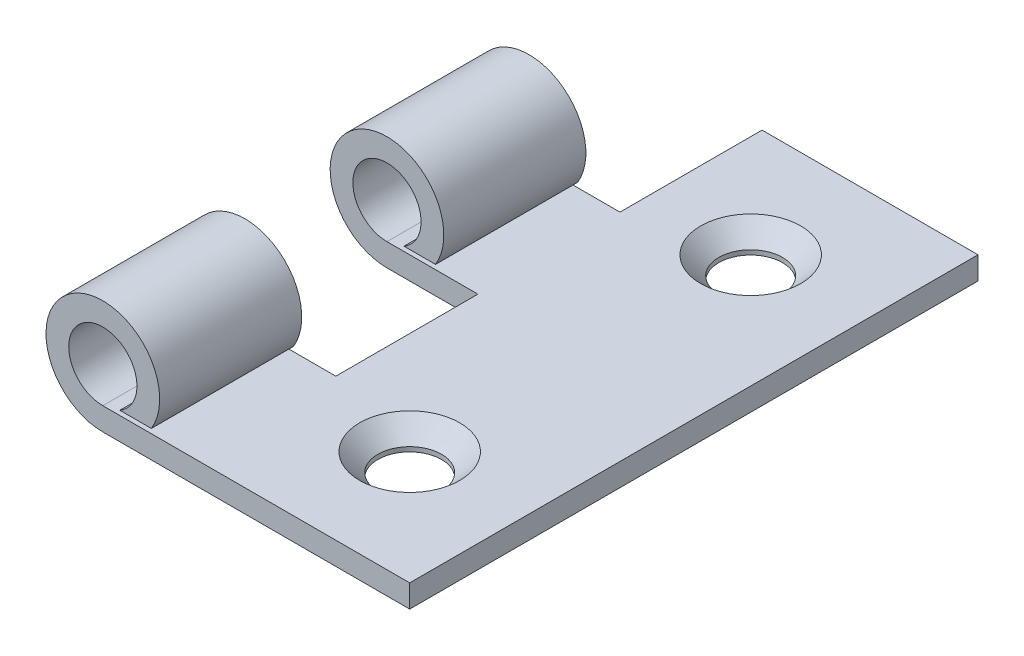
ISO-10303-21;
HEADER;
FILE_DESCRIPTION(('STEP AP214'),'2;1');
FILE_NAME('part.step','',(''),(''),'','','');
FILE_SCHEMA(('AUTOMOTIVE_DESIGN { 1 0 10303 214 1 1 1 1 }'));
ENDSEC;
DATA;
#1=APPLICATION_CONTEXT('core data for automotive mechanical design processes');
#2=APPLICATION_PROTOCOL_DEFINITION('international standard','automotive_design',2000,#1);
#3=PRODUCT_CONTEXT('',#1,'mechanical');
#4=PRODUCT('Part','Part','',(#3));
#5=PRODUCT_RELATED_PRODUCT_CATEGORY('part','',(#4));
#6=PRODUCT_DEFINITION_FORMATION('','',#4);
#7=PRODUCT_DEFINITION_CONTEXT('part definition',#1,'design');
#8=PRODUCT_DEFINITION('design','',#6,#7);
#9=PRODUCT_DEFINITION_SHAPE('','',#8);
#10=(LENGTH_UNIT() NAMED_UNIT(*) SI_UNIT(.MILLI.,.METRE.));
#11=(NAMED_UNIT(*) PLANE_ANGLE_UNIT() SI_UNIT($,.RADIAN.));
#12=(NAMED_UNIT(*) SI_UNIT($,.STERADIAN.) SOLID_ANGLE_UNIT());
#13=UNCERTAINTY_MEASURE_WITH_UNIT(LENGTH_MEASURE(1.E-05),#10,'distance_accuracy_value','');
#14=(GEOMETRIC_REPRESENTATION_CONTEXT(3) GLOBAL_UNCERTAINTY_ASSIGNED_CONTEXT((#13)) GLOBAL_UNIT_ASSIGNED_CONTEXT((#10,
#11,#12)) REPRESENTATION_CONTEXT('',''));
#15=CARTESIAN_POINT('',(0.,0.,0.));
#16=DIRECTION('',(0.,0.,1.));
#17=DIRECTION('',(1.,0.,0.));
#18=AXIS2_PLACEMENT_3D('',#15,#16,#17);
#19=CARTESIAN_POINT('',(0.,2.5,25.));
#20=DIRECTION('',(0.,0.,-1.));
#21=DIRECTION('',(-1.,0.,0.));
#22=AXIS2_PLACEMENT_3D('',#19,#20,#21);
#23=CYLINDRICAL_SURFACE('',#22,2.5);
#24=DIRECTION('',(0.,0.,-1.));
#25=VECTOR('',#24,1.);
#26=CARTESIAN_POINT('',(2.13541565040626,1.2,25.));
#27=LINE('',#26,#25);
#28=CARTESIAN_POINT('',(2.13541565040626,1.2,25.));
#29=VERTEX_POINT('',#28);
#30=CARTESIAN_POINT('',(2.13541565040626,1.2,18.75));
#31=VERTEX_POINT('',#30);
#32=EDGE_CURVE('E213',#29,#31,#27,.T.);
#33=ORIENTED_EDGE('',*,*,#32,.T.);
#34=CARTESIAN_POINT('',(0.,2.5,18.75));
#35=DIRECTION('',(0.,0.,1.));
#36=DIRECTION('',(1.,0.,0.));
#37=AXIS2_PLACEMENT_3D('',#34,#35,#36);
#38=CIRCLE('',#37,2.5);
#39=CARTESIAN_POINT('',(0.,0.,18.75));
#40=VERTEX_POINT('',#39);
#41=EDGE_CURVE('E177',#31,#40,#38,.T.);
#42=ORIENTED_EDGE('',*,*,#41,.T.);
#43=DIRECTION('',(0.,0.,-1.));
#44=VECTOR('',#43,1.);
#45=CARTESIAN_POINT('',(0.,0.,25.));
#46=LINE('',#45,#44);
#47=CARTESIAN_POINT('',(0.,0.,25.));
#48=VERTEX_POINT('',#47);
#49=EDGE_CURVE('E230',#48,#40,#46,.T.);
#50=ORIENTED_EDGE('',*,*,#49,.F.);
#51=CARTESIAN_POINT('',(0.,2.5,25.));
#52=DIRECTION('',(0.,0.,1.));
#53=DIRECTION('',(1.,0.,0.));
#54=AXIS2_PLACEMENT_3D('',#51,#52,#53);
#55=CIRCLE('',#54,2.5);
#56=EDGE_CURVE('E199',#29,#48,#55,.T.);
#57=ORIENTED_EDGE('',*,*,#56,.F.);
#58=EDGE_LOOP('',(#33,#42,#50,#57));
#59=FACE_BOUND('',#58,.T.);
#60=ADVANCED_FACE('F29',(#59),#23,.T.);
#61=CARTESIAN_POINT('',(0.,2.5,25.));
#62=DIRECTION('',(0.,0.,-1.));
#63=DIRECTION('',(-1.,0.,0.));
#64=AXIS2_PLACEMENT_3D('',#61,#62,#63);
#65=CYLINDRICAL_SURFACE('',#64,1.5);
#66=DIRECTION('',(0.,0.,-1.));
#67=VECTOR('',#66,1.);
#68=CARTESIAN_POINT('',(0.,1.,25.));
#69=LINE('',#68,#67);
#70=CARTESIAN_POINT('',(0.,1.,25.));
#71=VERTEX_POINT('',#70);
#72=CARTESIAN_POINT('',(0.,1.,18.75));
#73=VERTEX_POINT('',#72);
#74=EDGE_CURVE('E221',#71,#73,#69,.T.);
#75=ORIENTED_EDGE('',*,*,#74,.T.);
#76=CARTESIAN_POINT('',(0.,2.5,18.75));
#77=DIRECTION('',(0.,0.,1.));
#78=DIRECTION('',(1.,0.,0.));
#79=AXIS2_PLACEMENT_3D('',#76,#77,#78);
#80=CIRCLE('',#79,1.5);
#81=CARTESIAN_POINT('',(0.748331477354788,1.2,18.75));
#82=VERTEX_POINT('',#81);
#83=EDGE_CURVE('E171',#73,#82,#80,.F.);
#84=ORIENTED_EDGE('',*,*,#83,.T.);
#85=DIRECTION('',(0.,0.,-1.));
#86=VECTOR('',#85,1.);
#87=CARTESIAN_POINT('',(0.748331477354788,1.2,25.));
#88=LINE('',#87,#86);
#89=CARTESIAN_POINT('',(0.748331477354788,1.2,25.));
#90=VERTEX_POINT('',#89);
#91=EDGE_CURVE('E217',#90,#82,#88,.T.);
#92=ORIENTED_EDGE('',*,*,#91,.F.);
#93=CARTESIAN_POINT('',(0.,2.5,25.));
#94=DIRECTION('',(0.,0.,-1.));
#95=DIRECTION('',(1.,0.,0.));
#96=AXIS2_PLACEMENT_3D('',#93,#94,#95);
#97=CIRCLE('',#96,1.5);
#98=EDGE_CURVE('E208',#71,#90,#97,.T.);
#99=ORIENTED_EDGE('',*,*,#98,.F.);
#100=EDGE_LOOP('',(#75,#84,#92,#99));
#101=FACE_BOUND('',#100,.T.);
#102=ADVANCED_FACE('F296',(#101),#65,.F.);
#103=CARTESIAN_POINT('',(0.748331477354788,1.2,25.));
#104=DIRECTION('',(0.,1.,0.));
#105=DIRECTION('',(0.,0.,1.));
#106=AXIS2_PLACEMENT_3D('',#103,#104,#105);
#107=PLANE('',#106);
#108=ORIENTED_EDGE('',*,*,#91,.T.);
#109=DIRECTION('',(1.,0.,0.));
#110=VECTOR('',#109,1.);
#111=CARTESIAN_POINT('',(0.748331477354788,1.2,18.75));
#112=LINE('',#111,#110);
#113=EDGE_CURVE('E235',#82,#31,#112,.T.);
#114=ORIENTED_EDGE('',*,*,#113,.T.);
#115=ORIENTED_EDGE('',*,*,#32,.F.);
#116=DIRECTION('',(1.,0.,0.));
#117=VECTOR('',#116,1.);
#118=CARTESIAN_POINT('',(0.748331477354788,1.2,25.));
#119=LINE('',#118,#117);
#120=EDGE_CURVE('E210',#90,#29,#119,.T.);
#121=ORIENTED_EDGE('',*,*,#120,.F.);
#122=EDGE_LOOP('',(#108,#114,#115,#121));
#123=FACE_BOUND('',#122,.T.);
#124=ADVANCED_FACE('F291',(#123),#107,.F.);
#125=CARTESIAN_POINT('',(2.13541565040626,1.2,12.5));
#126=VERTEX_POINT('',#125);
#127=CARTESIAN_POINT('',(2.13541565040626,1.2,6.25));
#128=VERTEX_POINT('',#127);
#129=EDGE_CURVE('E212',#126,#128,#27,.T.);
#130=ORIENTED_EDGE('',*,*,#129,.T.);
#131=CARTESIAN_POINT('',(0.,2.5,6.25));
#132=DIRECTION('',(0.,0.,1.));
#133=DIRECTION('',(1.,0.,0.));
#134=AXIS2_PLACEMENT_3D('',#131,#132,#133);
#135=CIRCLE('',#134,2.5);
#136=CARTESIAN_POINT('',(0.,0.,6.25));
#137=VERTEX_POINT('',#136);
#138=EDGE_CURVE('E152',#128,#137,#135,.T.);
#139=ORIENTED_EDGE('',*,*,#138,.T.);
#140=CARTESIAN_POINT('',(0.,0.,12.5));
#141=VERTEX_POINT('',#140);
#142=EDGE_CURVE('E150',#141,#137,#46,.T.);
#143=ORIENTED_EDGE('',*,*,#142,.F.);
#144=CARTESIAN_POINT('',(0.,2.5,12.5));
#145=DIRECTION('',(0.,0.,-1.));
#146=DIRECTION('',(-1.,0.,0.));
#147=AXIS2_PLACEMENT_3D('',#144,#145,#146);
#148=CIRCLE('',#147,2.5);
#149=EDGE_CURVE('E166',#141,#126,#148,.T.);
#150=ORIENTED_EDGE('',*,*,#149,.T.);
#151=EDGE_LOOP('',(#130,#139,#143,#150));
#152=FACE_BOUND('',#151,.T.);
#153=ADVANCED_FACE('F31',(#152),#23,.T.);
#154=CARTESIAN_POINT('',(0.,0.,25.));
#155=DIRECTION('',(0.,1.,0.));
#156=DIRECTION('',(-1.,0.,0.));
#157=AXIS2_PLACEMENT_3D('',#154,#155,#156);
#158=PLANE('',#157);
#159=CARTESIAN_POINT('',(8.49999999999999,0.,5.));
#160=DIRECTION('',(0.,1.,0.));
#161=DIRECTION('',(-1.,0.,0.));
#162=AXIS2_PLACEMENT_3D('',#159,#160,#161);
#163=CIRCLE('',#162,1.4);
#164=CARTESIAN_POINT('',(7.1,0.,5.));
#165=VERTEX_POINT('',#164);
#166=EDGE_CURVE('E186',#165,#165,#163,.T.);
#167=ORIENTED_EDGE('',*,*,#166,.T.);
#168=EDGE_LOOP('',(#167));
#169=FACE_BOUND('',#168,.T.);
#170=CARTESIAN_POINT('',(8.49999999999999,0.,20.));
#171=DIRECTION('',(0.,1.,0.));
#172=DIRECTION('',(-1.,0.,0.));
#173=AXIS2_PLACEMENT_3D('',#170,#171,#172);
#174=CIRCLE('',#173,1.4);
#175=CARTESIAN_POINT('',(7.1,0.,20.));
#176=VERTEX_POINT('',#175);
#177=EDGE_CURVE('E189',#176,#176,#174,.T.);
#178=ORIENTED_EDGE('',*,*,#177,.T.);
#179=EDGE_LOOP('',(#178));
#180=FACE_BOUND('',#179,.T.);
#181=DIRECTION('',(1.,0.,0.));
#182=VECTOR('',#181,1.);
#183=CARTESIAN_POINT('',(0.,0.,6.25));
#184=LINE('',#183,#182);
#185=CARTESIAN_POINT('',(4.00000000000003,0.,6.25));
#186=VERTEX_POINT('',#185);
#187=EDGE_CURVE('E141',#137,#186,#184,.T.);
#188=ORIENTED_EDGE('',*,*,#187,.T.);
#189=DIRECTION('',(0.,0.,-1.));
#190=VECTOR('',#189,1.);
#191=CARTESIAN_POINT('',(4.00000000000003,0.,25.));
#192=LINE('',#191,#190);
#193=CARTESIAN_POINT('',(4.00000000000003,0.,0.));
#194=VERTEX_POINT('',#193);
#195=EDGE_CURVE('E129',#186,#194,#192,.T.);
#196=ORIENTED_EDGE('',*,*,#195,.T.);
#197=DIRECTION('',(1.,0.,0.));
#198=VECTOR('',#197,1.);
#199=CARTESIAN_POINT('',(0.,0.,0.));
#200=LINE('',#199,#198);
#201=CARTESIAN_POINT('',(13.5,0.,0.));
#202=VERTEX_POINT('',#201);
#203=EDGE_CURVE('E192',#194,#202,#200,.T.);
#204=ORIENTED_EDGE('',*,*,#203,.T.);
#205=DIRECTION('',(0.,0.,-1.));
#206=VECTOR('',#205,1.);
#207=CARTESIAN_POINT('',(13.5,0.,25.));
#208=LINE('',#207,#206);
#209=CARTESIAN_POINT('',(13.5,0.,25.));
#210=VERTEX_POINT('',#209);
#211=EDGE_CURVE('E227',#210,#202,#208,.T.);
#212=ORIENTED_EDGE('',*,*,#211,.F.);
#213=DIRECTION('',(1.,0.,0.));
#214=VECTOR('',#213,1.);
#215=CARTESIAN_POINT('',(0.,0.,25.));
#216=LINE('',#215,#214);
#217=EDGE_CURVE('E202',#48,#210,#216,.T.);
#218=ORIENTED_EDGE('',*,*,#217,.F.);
#219=ORIENTED_EDGE('',*,*,#49,.T.);
#220=DIRECTION('',(1.,0.,0.));
#221=VECTOR('',#220,1.);
#222=CARTESIAN_POINT('',(0.,0.,18.75));
#223=LINE('',#222,#221);
#224=CARTESIAN_POINT('',(4.00000000000003,0.,18.75));
#225=VERTEX_POINT('',#224);
#226=EDGE_CURVE('E180',#40,#225,#223,.T.);
#227=ORIENTED_EDGE('',*,*,#226,.T.);
#228=DIRECTION('',(0.,0.,-1.));
#229=VECTOR('',#228,1.);
#230=CARTESIAN_POINT('',(4.00000000000003,0.,25.));
#231=LINE('',#230,#229);
#232=CARTESIAN_POINT('',(4.00000000000003,0.,12.5));
#233=VERTEX_POINT('',#232);
#234=EDGE_CURVE('E183',#225,#233,#231,.T.);
#235=ORIENTED_EDGE('',*,*,#234,.T.);
#236=DIRECTION('',(-1.,0.,0.));
#237=VECTOR('',#236,1.);
#238=CARTESIAN_POINT('',(0.,0.,12.5));
#239=LINE('',#238,#237);
#240=EDGE_CURVE('E169',#233,#141,#239,.T.);
#241=ORIENTED_EDGE('',*,*,#240,.T.);
#242=ORIENTED_EDGE('',*,*,#142,.T.);
#243=EDGE_LOOP('',(#188,#196,#204,#212,#218,#219,#227,#235,#241,#242));
#244=FACE_BOUND('',#243,.T.);
#245=ADVANCED_FACE('F147',(#169,#180,#244),#158,.F.);
#246=CARTESIAN_POINT('',(13.5,1.,25.));
#247=DIRECTION('',(-1.,0.,0.));
#248=DIRECTION('',(0.,-1.,0.));
#249=AXIS2_PLACEMENT_3D('',#246,#247,#248);
#250=PLANE('',#249);
#251=DIRECTION('',(0.,1.,0.));
#252=VECTOR('',#251,1.);
#253=CARTESIAN_POINT('',(13.5,1.,0.));
#254=LINE('',#253,#252);
#255=CARTESIAN_POINT('',(13.5,1.,0.));
#256=VERTEX_POINT('',#255);
#257=EDGE_CURVE('E194',#202,#256,#254,.T.);
#258=ORIENTED_EDGE('',*,*,#257,.T.);
#259=DIRECTION('',(0.,0.,-1.));
#260=VECTOR('',#259,1.);
#261=CARTESIAN_POINT('',(13.5,1.,25.));
#262=LINE('',#261,#260);
#263=CARTESIAN_POINT('',(13.5,1.,25.));
#264=VERTEX_POINT('',#263);
#265=EDGE_CURVE('E224',#264,#256,#262,.T.);
#266=ORIENTED_EDGE('',*,*,#265,.F.);
#267=DIRECTION('',(0.,1.,0.));
#268=VECTOR('',#267,1.);
#269=CARTESIAN_POINT('',(13.5,1.,25.));
#270=LINE('',#269,#268);
#271=EDGE_CURVE('E204',#210,#264,#270,.T.);
#272=ORIENTED_EDGE('',*,*,#271,.F.);
#273=ORIENTED_EDGE('',*,*,#211,.T.);
#274=EDGE_LOOP('',(#258,#266,#272,#273));
#275=FACE_BOUND('',#274,.T.);
#276=ADVANCED_FACE('F267',(#275),#250,.F.);
#277=CARTESIAN_POINT('',(0.,1.,25.));
#278=DIRECTION('',(0.,-1.,0.));
#279=DIRECTION('',(1.,0.,0.));
#280=AXIS2_PLACEMENT_3D('',#277,#278,#279);
#281=PLANE('',#280);
#282=CARTESIAN_POINT('',(8.49999999999999,1.,5.));
#283=DIRECTION('',(0.,-1.,0.));
#284=DIRECTION('',(1.,0.,0.));
#285=AXIS2_PLACEMENT_3D('',#282,#283,#284);
#286=CIRCLE('',#285,2.2);
#287=CARTESIAN_POINT('',(10.7,1.,5.));
#288=VERTEX_POINT('',#287);
#289=EDGE_CURVE('E248',#288,#288,#286,.T.);
#290=ORIENTED_EDGE('',*,*,#289,.T.);
#291=EDGE_LOOP('',(#290));
#292=FACE_BOUND('',#291,.T.);
#293=CARTESIAN_POINT('',(8.49999999999999,1.,20.));
#294=DIRECTION('',(0.,-1.,0.));
#295=DIRECTION('',(1.,0.,0.));
#296=AXIS2_PLACEMENT_3D('',#293,#294,#295);
#297=CIRCLE('',#296,2.2);
#298=CARTESIAN_POINT('',(10.7,1.,20.));
#299=VERTEX_POINT('',#298);
#300=EDGE_CURVE('E245',#299,#299,#297,.T.);
#301=ORIENTED_EDGE('',*,*,#300,.T.);
#302=EDGE_LOOP('',(#301));
#303=FACE_BOUND('',#302,.T.);
#304=DIRECTION('',(-1.,0.,0.));
#305=VECTOR('',#304,1.);
#306=CARTESIAN_POINT('',(0.,1.,0.));
#307=LINE('',#306,#305);
#308=CARTESIAN_POINT('',(4.00000000000003,1.,0.));
#309=VERTEX_POINT('',#308);
#310=EDGE_CURVE('E196',#256,#309,#307,.T.);
#311=ORIENTED_EDGE('',*,*,#310,.T.);
#312=DIRECTION('',(0.,0.,1.));
#313=VECTOR('',#312,1.);
#314=CARTESIAN_POINT('',(4.00000000000003,1.,25.));
#315=LINE('',#314,#313);
#316=CARTESIAN_POINT('',(4.00000000000003,1.,6.25));
#317=VERTEX_POINT('',#316);
#318=EDGE_CURVE('E44',#309,#317,#315,.T.);
#319=ORIENTED_EDGE('',*,*,#318,.T.);
#320=DIRECTION('',(-1.,0.,0.));
#321=VECTOR('',#320,1.);
#322=CARTESIAN_POINT('',(0.,1.,6.25));
#323=LINE('',#322,#321);
#324=CARTESIAN_POINT('',(0.,1.,6.25));
#325=VERTEX_POINT('',#324);
#326=EDGE_CURVE('E144',#317,#325,#323,.T.);
#327=ORIENTED_EDGE('',*,*,#326,.T.);
#328=CARTESIAN_POINT('',(0.,1.,12.5));
#329=VERTEX_POINT('',#328);
#330=EDGE_CURVE('E220',#329,#325,#69,.T.);
#331=ORIENTED_EDGE('',*,*,#330,.F.);
#332=DIRECTION('',(1.,0.,0.));
#333=VECTOR('',#332,1.);
#334=CARTESIAN_POINT('',(0.,1.,12.5));
#335=LINE('',#334,#333);
#336=CARTESIAN_POINT('',(4.00000000000003,1.,12.5));
#337=VERTEX_POINT('',#336);
#338=EDGE_CURVE('E163',#329,#337,#335,.T.);
#339=ORIENTED_EDGE('',*,*,#338,.T.);
#340=DIRECTION('',(0.,0.,1.));
#341=VECTOR('',#340,1.);
#342=CARTESIAN_POINT('',(4.00000000000003,1.,25.));
#343=LINE('',#342,#341);
#344=CARTESIAN_POINT('',(4.00000000000003,1.,18.75));
#345=VERTEX_POINT('',#344);
#346=EDGE_CURVE('E238',#337,#345,#343,.T.);
#347=ORIENTED_EDGE('',*,*,#346,.T.);
#348=DIRECTION('',(-1.,0.,0.));
#349=VECTOR('',#348,1.);
#350=CARTESIAN_POINT('',(0.,1.,18.75));
#351=LINE('',#350,#349);
#352=EDGE_CURVE('E174',#345,#73,#351,.T.);
#353=ORIENTED_EDGE('',*,*,#352,.T.);
#354=ORIENTED_EDGE('',*,*,#74,.F.);
#355=DIRECTION('',(-1.,0.,0.));
#356=VECTOR('',#355,1.);
#357=CARTESIAN_POINT('',(0.,1.,25.));
#358=LINE('',#357,#356);
#359=EDGE_CURVE('E206',#264,#71,#358,.T.);
#360=ORIENTED_EDGE('',*,*,#359,.F.);
#361=ORIENTED_EDGE('',*,*,#265,.T.);
#362=EDGE_LOOP('',(#311,#319,#327,#331,#339,#347,#353,#354,#360,#361));
#363=FACE_BOUND('',#362,.T.);
#364=ADVANCED_FACE('F263',(#292,#303,#363),#281,.F.);
#365=ORIENTED_EDGE('',*,*,#330,.T.);
#366=CARTESIAN_POINT('',(0.,2.5,6.25));
#367=DIRECTION('',(0.,0.,1.));
#368=DIRECTION('',(1.,0.,0.));
#369=AXIS2_PLACEMENT_3D('',#366,#367,#368);
#370=CIRCLE('',#369,1.5);
#371=CARTESIAN_POINT('',(0.748331477354788,1.2,6.25));
#372=VERTEX_POINT('',#371);
#373=EDGE_CURVE('E137',#325,#372,#370,.F.);
#374=ORIENTED_EDGE('',*,*,#373,.T.);
#375=CARTESIAN_POINT('',(0.748331477354788,1.2,12.5));
#376=VERTEX_POINT('',#375);
#377=EDGE_CURVE('E216',#376,#372,#88,.T.);
#378=ORIENTED_EDGE('',*,*,#377,.F.);
#379=CARTESIAN_POINT('',(0.,2.5,12.5));
#380=DIRECTION('',(0.,0.,-1.));
#381=DIRECTION('',(-1.,0.,0.));
#382=AXIS2_PLACEMENT_3D('',#379,#380,#381);
#383=CIRCLE('',#382,1.5);
#384=EDGE_CURVE('E52',#376,#329,#383,.F.);
#385=ORIENTED_EDGE('',*,*,#384,.T.);
#386=EDGE_LOOP('',(#365,#374,#378,#385));
#387=FACE_BOUND('',#386,.T.);
#388=ADVANCED_FACE('F266',(#387),#65,.F.);
#389=ORIENTED_EDGE('',*,*,#377,.T.);
#390=DIRECTION('',(1.,0.,0.));
#391=VECTOR('',#390,1.);
#392=CARTESIAN_POINT('',(0.748331477354788,1.2,6.25));
#393=LINE('',#392,#391);
#394=EDGE_CURVE('E242',#372,#128,#393,.T.);
#395=ORIENTED_EDGE('',*,*,#394,.T.);
#396=ORIENTED_EDGE('',*,*,#129,.F.);
#397=DIRECTION('',(-1.,0.,0.));
#398=VECTOR('',#397,1.);
#399=CARTESIAN_POINT('',(0.748331477354788,1.2,12.5));
#400=LINE('',#399,#398);
#401=EDGE_CURVE('E233',#126,#376,#400,.T.);
#402=ORIENTED_EDGE('',*,*,#401,.T.);
#403=EDGE_LOOP('',(#389,#395,#396,#402));
#404=FACE_BOUND('',#403,.T.);
#405=ADVANCED_FACE('F308',(#404),#107,.F.);
#406=CARTESIAN_POINT('',(0.,2.5,25.));
#407=DIRECTION('',(0.,0.,1.));
#408=DIRECTION('',(1.,0.,0.));
#409=AXIS2_PLACEMENT_3D('',#406,#407,#408);
#410=PLANE('',#409);
#411=ORIENTED_EDGE('',*,*,#56,.T.);
#412=ORIENTED_EDGE('',*,*,#217,.T.);
#413=ORIENTED_EDGE('',*,*,#271,.T.);
#414=ORIENTED_EDGE('',*,*,#359,.T.);
#415=ORIENTED_EDGE('',*,*,#98,.T.);
#416=ORIENTED_EDGE('',*,*,#120,.T.);
#417=EDGE_LOOP('',(#411,#412,#413,#414,#415,#416));
#418=FACE_BOUND('',#417,.T.);
#419=ADVANCED_FACE('F281',(#418),#410,.T.);
#420=CARTESIAN_POINT('',(0.,2.5,0.));
#421=DIRECTION('',(0.,0.,1.));
#422=DIRECTION('',(1.,0.,0.));
#423=AXIS2_PLACEMENT_3D('',#420,#421,#422);
#424=PLANE('',#423);
#425=ORIENTED_EDGE('',*,*,#203,.F.);
#426=DIRECTION('',(0.,1.,0.));
#427=VECTOR('',#426,1.);
#428=CARTESIAN_POINT('',(4.00000000000003,2.5,0.));
#429=LINE('',#428,#427);
#430=EDGE_CURVE('E133',#194,#309,#429,.T.);
#431=ORIENTED_EDGE('',*,*,#430,.T.);
#432=ORIENTED_EDGE('',*,*,#310,.F.);
#433=ORIENTED_EDGE('',*,*,#257,.F.);
#434=EDGE_LOOP('',(#425,#431,#432,#433));
#435=FACE_BOUND('',#434,.T.);
#436=ADVANCED_FACE('F276',(#435),#424,.F.);
#437=CARTESIAN_POINT('',(8.49999999999999,-24.,20.));
#438=DIRECTION('',(0.,1.,0.));
#439=DIRECTION('',(-1.,0.,0.));
#440=AXIS2_PLACEMENT_3D('',#437,#438,#439);
#441=CYLINDRICAL_SURFACE('',#440,1.4);
#442=CARTESIAN_POINT('',(8.49999999999999,0.199999999999999,20.));
#443=DIRECTION('',(0.,-1.,0.));
#444=DIRECTION('',(0.,0.,-1.));
#445=AXIS2_PLACEMENT_3D('',#442,#443,#444);
#446=CIRCLE('',#445,1.4);
#447=CARTESIAN_POINT('',(8.49999999999999,0.199999999999999,18.6));
#448=VERTEX_POINT('',#447);
#449=EDGE_CURVE('E11',#448,#448,#446,.F.);
#450=ORIENTED_EDGE('',*,*,#449,.T.);
#451=EDGE_LOOP('',(#450));
#452=FACE_BOUND('',#451,.T.);
#453=ORIENTED_EDGE('',*,*,#177,.F.);
#454=EDGE_LOOP('',(#453));
#455=FACE_BOUND('',#454,.T.);
#456=ADVANCED_FACE('F337',(#452,#455),#441,.F.);
#457=CARTESIAN_POINT('',(8.49999999999999,-24.,5.));
#458=DIRECTION('',(0.,1.,0.));
#459=DIRECTION('',(-1.,0.,0.));
#460=AXIS2_PLACEMENT_3D('',#457,#458,#459);
#461=CYLINDRICAL_SURFACE('',#460,1.4);
#462=CARTESIAN_POINT('',(8.49999999999999,0.199999999999999,5.));
#463=DIRECTION('',(0.,-1.,0.));
#464=DIRECTION('',(0.,0.,-1.));
#465=AXIS2_PLACEMENT_3D('',#462,#463,#464);
#466=CIRCLE('',#465,1.4);
#467=CARTESIAN_POINT('',(8.49999999999999,0.199999999999999,3.6));
#468=VERTEX_POINT('',#467);
#469=EDGE_CURVE('E37',#468,#468,#466,.F.);
#470=ORIENTED_EDGE('',*,*,#469,.T.);
#471=EDGE_LOOP('',(#470));
#472=FACE_BOUND('',#471,.T.);
#473=ORIENTED_EDGE('',*,*,#166,.F.);
#474=EDGE_LOOP('',(#473));
#475=FACE_BOUND('',#474,.T.);
#476=ADVANCED_FACE('F253',(#472,#475),#461,.F.);
#477=CARTESIAN_POINT('',(4.00000000000003,-24.,12.5));
#478=DIRECTION('',(1.,0.,0.));
#479=DIRECTION('',(0.,1.,0.));
#480=AXIS2_PLACEMENT_3D('',#477,#478,#479);
#481=PLANE('',#480);
#482=DIRECTION('',(0.,1.,0.));
#483=VECTOR('',#482,1.);
#484=CARTESIAN_POINT('',(4.00000000000003,-24.,18.75));
#485=LINE('',#484,#483);
#486=EDGE_CURVE('E155',#225,#345,#485,.T.);
#487=ORIENTED_EDGE('',*,*,#486,.T.);
#488=ORIENTED_EDGE('',*,*,#346,.F.);
#489=DIRECTION('',(0.,1.,0.));
#490=VECTOR('',#489,1.);
#491=CARTESIAN_POINT('',(4.00000000000003,-24.,12.5));
#492=LINE('',#491,#490);
#493=EDGE_CURVE('E151',#233,#337,#492,.T.);
#494=ORIENTED_EDGE('',*,*,#493,.F.);
#495=ORIENTED_EDGE('',*,*,#234,.F.);
#496=EDGE_LOOP('',(#487,#488,#494,#495));
#497=FACE_BOUND('',#496,.T.);
#498=ADVANCED_FACE('F300',(#497),#481,.F.);
#499=CARTESIAN_POINT('',(4.00000000000003,-24.,18.75));
#500=DIRECTION('',(0.,0.,1.));
#501=DIRECTION('',(1.,0.,0.));
#502=AXIS2_PLACEMENT_3D('',#499,#500,#501);
#503=PLANE('',#502);
#504=ORIENTED_EDGE('',*,*,#41,.F.);
#505=ORIENTED_EDGE('',*,*,#113,.F.);
#506=ORIENTED_EDGE('',*,*,#83,.F.);
#507=ORIENTED_EDGE('',*,*,#352,.F.);
#508=ORIENTED_EDGE('',*,*,#486,.F.);
#509=ORIENTED_EDGE('',*,*,#226,.F.);
#510=EDGE_LOOP('',(#504,#505,#506,#507,#508,#509));
#511=FACE_BOUND('',#510,.T.);
#512=ADVANCED_FACE('F288',(#511),#503,.F.);
#513=CARTESIAN_POINT('',(4.00000000000003,-24.,12.5));
#514=DIRECTION('',(0.,0.,-1.));
#515=DIRECTION('',(-1.,0.,0.));
#516=AXIS2_PLACEMENT_3D('',#513,#514,#515);
#517=PLANE('',#516);
#518=ORIENTED_EDGE('',*,*,#493,.T.);
#519=ORIENTED_EDGE('',*,*,#338,.F.);
#520=ORIENTED_EDGE('',*,*,#384,.F.);
#521=ORIENTED_EDGE('',*,*,#401,.F.);
#522=ORIENTED_EDGE('',*,*,#149,.F.);
#523=ORIENTED_EDGE('',*,*,#240,.F.);
#524=EDGE_LOOP('',(#518,#519,#520,#521,#522,#523));
#525=FACE_BOUND('',#524,.T.);
#526=ADVANCED_FACE('F301',(#525),#517,.F.);
#527=CARTESIAN_POINT('',(4.00000000000003,-24.,6.25));
#528=DIRECTION('',(0.,0.,1.));
#529=DIRECTION('',(1.,0.,0.));
#530=AXIS2_PLACEMENT_3D('',#527,#528,#529);
#531=PLANE('',#530);
#532=ORIENTED_EDGE('',*,*,#138,.F.);
#533=ORIENTED_EDGE('',*,*,#394,.F.);
#534=ORIENTED_EDGE('',*,*,#373,.F.);
#535=ORIENTED_EDGE('',*,*,#326,.F.);
#536=DIRECTION('',(0.,1.,0.));
#537=VECTOR('',#536,1.);
#538=CARTESIAN_POINT('',(4.00000000000003,-24.,6.25));
#539=LINE('',#538,#537);
#540=EDGE_CURVE('E132',#186,#317,#539,.T.);
#541=ORIENTED_EDGE('',*,*,#540,.F.);
#542=ORIENTED_EDGE('',*,*,#187,.F.);
#543=EDGE_LOOP('',(#532,#533,#534,#535,#541,#542));
#544=FACE_BOUND('',#543,.T.);
#545=ADVANCED_FACE('F140',(#544),#531,.F.);
#546=CARTESIAN_POINT('',(4.00000000000003,-24.,-1.32180854618603));
#547=DIRECTION('',(1.,0.,0.));
#548=DIRECTION('',(0.,1.,0.));
#549=AXIS2_PLACEMENT_3D('',#546,#547,#548);
#550=PLANE('',#549);
#551=ORIENTED_EDGE('',*,*,#540,.T.);
#552=ORIENTED_EDGE('',*,*,#318,.F.);
#553=ORIENTED_EDGE('',*,*,#430,.F.);
#554=ORIENTED_EDGE('',*,*,#195,.F.);
#555=EDGE_LOOP('',(#551,#552,#553,#554));
#556=FACE_BOUND('',#555,.T.);
#557=ADVANCED_FACE('F131',(#556),#550,.F.);
#558=CARTESIAN_POINT('',(8.49999999999999,1.,5.));
#559=DIRECTION('',(0.,1.,0.));
#560=DIRECTION('',(0.,0.,1.));
#561=AXIS2_PLACEMENT_3D('',#558,#559,#560);
#562=CONICAL_SURFACE('',#561,2.2,0.785398163397448);
#563=ORIENTED_EDGE('',*,*,#469,.F.);
#564=EDGE_LOOP('',(#563));
#565=FACE_BOUND('',#564,.T.);
#566=ORIENTED_EDGE('',*,*,#289,.F.);
#567=EDGE_LOOP('',(#566));
#568=FACE_BOUND('',#567,.T.);
#569=ADVANCED_FACE('F256',(#565,#568),#562,.F.);
#570=CARTESIAN_POINT('',(8.49999999999999,1.,20.));
#571=DIRECTION('',(0.,1.,0.));
#572=DIRECTION('',(0.,0.,1.));
#573=AXIS2_PLACEMENT_3D('',#570,#571,#572);
#574=CONICAL_SURFACE('',#573,2.2,0.785398163397447);
#575=ORIENTED_EDGE('',*,*,#449,.F.);
#576=EDGE_LOOP('',(#575));
#577=FACE_BOUND('',#576,.T.);
#578=ORIENTED_EDGE('',*,*,#300,.F.);
#579=EDGE_LOOP('',(#578));
#580=FACE_BOUND('',#579,.T.);
#581=ADVANCED_FACE('F259',(#577,#580),#574,.F.);
#582=CLOSED_SHELL('',(#60,#102,#124,#153,#245,#276,#364,#388,#405,#419,#436,#456,#476,#498,#512,
#526,#545,#557,#569,#581));
#583=MANIFOLD_SOLID_BREP('B2',#582);
#584=ADVANCED_BREP_SHAPE_REPRESENTATION('',(#18,#583),#14);
#585=SHAPE_DEFINITION_REPRESENTATION(#9,#584);
ENDSEC;
END-ISO-10303-21;
